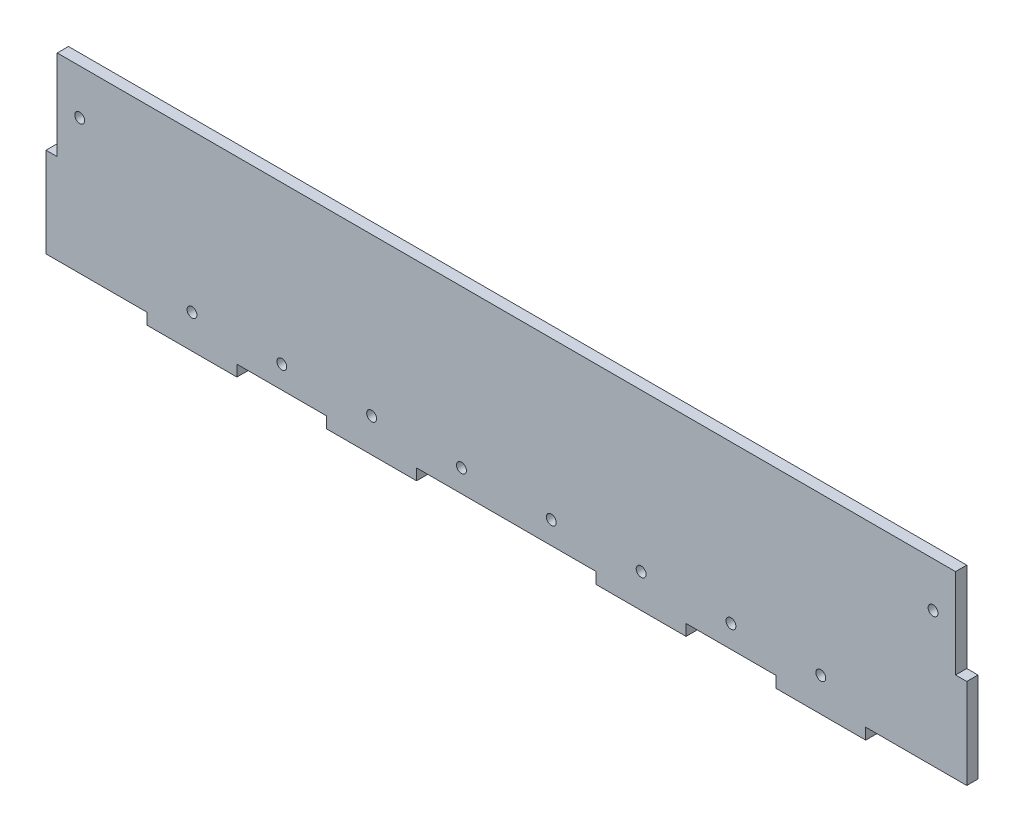
ISO-10303-21;
HEADER;
FILE_DESCRIPTION(('STEP AP214'),'2;1');
FILE_NAME('part.step','',(''),(''),'','','');
FILE_SCHEMA(('AUTOMOTIVE_DESIGN { 1 0 10303 214 1 1 1 1 }'));
ENDSEC;
DATA;
#1=APPLICATION_CONTEXT('core data for automotive mechanical design processes');
#2=APPLICATION_PROTOCOL_DEFINITION('international standard','automotive_design',2000,#1);
#3=PRODUCT_CONTEXT('',#1,'mechanical');
#4=PRODUCT('Part','Part','',(#3));
#5=PRODUCT_RELATED_PRODUCT_CATEGORY('part','',(#4));
#6=PRODUCT_DEFINITION_FORMATION('','',#4);
#7=PRODUCT_DEFINITION_CONTEXT('part definition',#1,'design');
#8=PRODUCT_DEFINITION('design','',#6,#7);
#9=PRODUCT_DEFINITION_SHAPE('','',#8);
#10=(LENGTH_UNIT() NAMED_UNIT(*) SI_UNIT(.MILLI.,.METRE.));
#11=(NAMED_UNIT(*) PLANE_ANGLE_UNIT() SI_UNIT($,.RADIAN.));
#12=(NAMED_UNIT(*) SI_UNIT($,.STERADIAN.) SOLID_ANGLE_UNIT());
#13=UNCERTAINTY_MEASURE_WITH_UNIT(LENGTH_MEASURE(1.E-05),#10,'distance_accuracy_value','');
#14=(GEOMETRIC_REPRESENTATION_CONTEXT(3) GLOBAL_UNCERTAINTY_ASSIGNED_CONTEXT((#13)) GLOBAL_UNIT_ASSIGNED_CONTEXT((#10,
#11,#12)) REPRESENTATION_CONTEXT('',''));
#15=CARTESIAN_POINT('',(0.,0.,0.));
#16=DIRECTION('',(0.,0.,1.));
#17=DIRECTION('',(1.,0.,0.));
#18=AXIS2_PLACEMENT_3D('',#15,#16,#17);
#19=CARTESIAN_POINT('',(-200.,0.,5.));
#20=DIRECTION('',(-1.,0.,0.));
#21=DIRECTION('',(0.,0.,1.));
#22=AXIS2_PLACEMENT_3D('',#19,#20,#21);
#23=PLANE('',#22);
#24=DIRECTION('',(0.,0.,1.));
#25=VECTOR('',#24,1.);
#26=CARTESIAN_POINT('',(-200.,-110.,0.));
#27=LINE('',#26,#25);
#28=CARTESIAN_POINT('',(-200.,-110.,0.));
#29=VERTEX_POINT('',#28);
#30=CARTESIAN_POINT('',(-200.,-110.,5.));
#31=VERTEX_POINT('',#30);
#32=EDGE_CURVE('E226',#29,#31,#27,.T.);
#33=ORIENTED_EDGE('',*,*,#32,.T.);
#34=DIRECTION('',(0.,1.,0.));
#35=VECTOR('',#34,1.);
#36=CARTESIAN_POINT('',(-200.,0.,5.));
#37=LINE('',#36,#35);
#38=CARTESIAN_POINT('',(-200.,-70.,5.));
#39=VERTEX_POINT('',#38);
#40=EDGE_CURVE('E220',#31,#39,#37,.T.);
#41=ORIENTED_EDGE('',*,*,#40,.T.);
#42=DIRECTION('',(0.,0.,1.));
#43=VECTOR('',#42,1.);
#44=CARTESIAN_POINT('',(-200.,-70.,0.));
#45=LINE('',#44,#43);
#46=CARTESIAN_POINT('',(-200.,-70.,0.));
#47=VERTEX_POINT('',#46);
#48=EDGE_CURVE('E202',#47,#39,#45,.T.);
#49=ORIENTED_EDGE('',*,*,#48,.F.);
#50=DIRECTION('',(0.,1.,0.));
#51=VECTOR('',#50,1.);
#52=CARTESIAN_POINT('',(-200.,0.,0.));
#53=LINE('',#52,#51);
#54=EDGE_CURVE('E343',#29,#47,#53,.T.);
#55=ORIENTED_EDGE('',*,*,#54,.F.);
#56=EDGE_LOOP('',(#33,#41,#49,#55));
#57=FACE_BOUND('',#56,.T.);
#58=ADVANCED_FACE('F40',(#57),#23,.T.);
#59=CARTESIAN_POINT('',(200.,0.,5.));
#60=DIRECTION('',(-1.,0.,0.));
#61=DIRECTION('',(0.,0.,1.));
#62=AXIS2_PLACEMENT_3D('',#59,#60,#61);
#63=PLANE('',#62);
#64=DIRECTION('',(0.,1.,0.));
#65=VECTOR('',#64,1.);
#66=CARTESIAN_POINT('',(200.,0.,0.));
#67=LINE('',#66,#65);
#68=CARTESIAN_POINT('',(200.,-109.868690954633,0.));
#69=VERTEX_POINT('',#68);
#70=CARTESIAN_POINT('',(200.,-70.,0.));
#71=VERTEX_POINT('',#70);
#72=EDGE_CURVE('E339',#69,#71,#67,.T.);
#73=ORIENTED_EDGE('',*,*,#72,.T.);
#74=DIRECTION('',(0.,0.,1.));
#75=VECTOR('',#74,1.);
#76=CARTESIAN_POINT('',(200.,-70.,0.));
#77=LINE('',#76,#75);
#78=CARTESIAN_POINT('',(200.,-70.,5.));
#79=VERTEX_POINT('',#78);
#80=EDGE_CURVE('E56',#71,#79,#77,.T.);
#81=ORIENTED_EDGE('',*,*,#80,.T.);
#82=DIRECTION('',(0.,1.,0.));
#83=VECTOR('',#82,1.);
#84=CARTESIAN_POINT('',(200.,0.,5.));
#85=LINE('',#84,#83);
#86=CARTESIAN_POINT('',(200.,-109.868690954633,5.));
#87=VERTEX_POINT('',#86);
#88=EDGE_CURVE('E222',#87,#79,#85,.T.);
#89=ORIENTED_EDGE('',*,*,#88,.F.);
#90=DIRECTION('',(0.,0.,1.));
#91=VECTOR('',#90,1.);
#92=CARTESIAN_POINT('',(200.,-109.868690954633,-5.));
#93=LINE('',#92,#91);
#94=EDGE_CURVE('E509',#69,#87,#93,.T.);
#95=ORIENTED_EDGE('',*,*,#94,.F.);
#96=EDGE_LOOP('',(#73,#81,#89,#95));
#97=FACE_BOUND('',#96,.T.);
#98=ADVANCED_FACE('F563',(#97),#63,.F.);
#99=CARTESIAN_POINT('',(0.,-150.,5.));
#100=DIRECTION('',(0.,1.,0.));
#101=DIRECTION('',(0.,0.,1.));
#102=AXIS2_PLACEMENT_3D('',#99,#100,#101);
#103=PLANE('',#102);
#104=DIRECTION('',(1.,0.,0.));
#105=VECTOR('',#104,1.);
#106=CARTESIAN_POINT('',(0.,-150.,0.));
#107=LINE('',#106,#105);
#108=CARTESIAN_POINT('',(-205.,-150.,0.));
#109=VERTEX_POINT('',#108);
#110=CARTESIAN_POINT('',(-160.,-150.,0.));
#111=VERTEX_POINT('',#110);
#112=EDGE_CURVE('E346',#109,#111,#107,.T.);
#113=ORIENTED_EDGE('',*,*,#112,.T.);
#114=DIRECTION('',(0.,0.,-1.));
#115=VECTOR('',#114,1.);
#116=CARTESIAN_POINT('',(-160.,-150.,5.));
#117=LINE('',#116,#115);
#118=CARTESIAN_POINT('',(-160.,-150.,5.));
#119=VERTEX_POINT('',#118);
#120=EDGE_CURVE('E49',#119,#111,#117,.T.);
#121=ORIENTED_EDGE('',*,*,#120,.F.);
#122=DIRECTION('',(1.,0.,0.));
#123=VECTOR('',#122,1.);
#124=CARTESIAN_POINT('',(0.,-150.,5.));
#125=LINE('',#124,#123);
#126=CARTESIAN_POINT('',(-205.,-150.,5.));
#127=VERTEX_POINT('',#126);
#128=EDGE_CURVE('E228',#127,#119,#125,.T.);
#129=ORIENTED_EDGE('',*,*,#128,.F.);
#130=DIRECTION('',(0.,0.,1.));
#131=VECTOR('',#130,1.);
#132=CARTESIAN_POINT('',(-205.,-150.,0.));
#133=LINE('',#132,#131);
#134=EDGE_CURVE('E212',#109,#127,#133,.T.);
#135=ORIENTED_EDGE('',*,*,#134,.F.);
#136=EDGE_LOOP('',(#113,#121,#129,#135));
#137=FACE_BOUND('',#136,.T.);
#138=ADVANCED_FACE('F484',(#137),#103,.F.);
#139=CARTESIAN_POINT('',(-160.,0.,5.));
#140=DIRECTION('',(1.,0.,0.));
#141=DIRECTION('',(0.,0.,-1.));
#142=AXIS2_PLACEMENT_3D('',#139,#140,#141);
#143=PLANE('',#142);
#144=DIRECTION('',(0.,-1.,0.));
#145=VECTOR('',#144,1.);
#146=CARTESIAN_POINT('',(-160.,0.,0.));
#147=LINE('',#146,#145);
#148=CARTESIAN_POINT('',(-160.,-155.,0.));
#149=VERTEX_POINT('',#148);
#150=EDGE_CURVE('E350',#111,#149,#147,.T.);
#151=ORIENTED_EDGE('',*,*,#150,.T.);
#152=DIRECTION('',(0.,0.,-1.));
#153=VECTOR('',#152,1.);
#154=CARTESIAN_POINT('',(-160.,-155.,5.));
#155=LINE('',#154,#153);
#156=CARTESIAN_POINT('',(-160.,-155.,5.));
#157=VERTEX_POINT('',#156);
#158=EDGE_CURVE('E473',#157,#149,#155,.T.);
#159=ORIENTED_EDGE('',*,*,#158,.F.);
#160=DIRECTION('',(0.,-1.,0.));
#161=VECTOR('',#160,1.);
#162=CARTESIAN_POINT('',(-160.,0.,5.));
#163=LINE('',#162,#161);
#164=EDGE_CURVE('E233',#119,#157,#163,.T.);
#165=ORIENTED_EDGE('',*,*,#164,.F.);
#166=ORIENTED_EDGE('',*,*,#120,.T.);
#167=EDGE_LOOP('',(#151,#159,#165,#166));
#168=FACE_BOUND('',#167,.T.);
#169=ADVANCED_FACE('F480',(#168),#143,.F.);
#170=CARTESIAN_POINT('',(0.,-155.,5.));
#171=DIRECTION('',(0.,1.,0.));
#172=DIRECTION('',(0.,0.,1.));
#173=AXIS2_PLACEMENT_3D('',#170,#171,#172);
#174=PLANE('',#173);
#175=DIRECTION('',(1.,0.,0.));
#176=VECTOR('',#175,1.);
#177=CARTESIAN_POINT('',(0.,-155.,0.));
#178=LINE('',#177,#176);
#179=CARTESIAN_POINT('',(-120.,-155.,0.));
#180=VERTEX_POINT('',#179);
#181=EDGE_CURVE('E354',#149,#180,#178,.T.);
#182=ORIENTED_EDGE('',*,*,#181,.T.);
#183=DIRECTION('',(0.,0.,-1.));
#184=VECTOR('',#183,1.);
#185=CARTESIAN_POINT('',(-120.,-155.,5.));
#186=LINE('',#185,#184);
#187=CARTESIAN_POINT('',(-120.,-155.,5.));
#188=VERTEX_POINT('',#187);
#189=EDGE_CURVE('E469',#188,#180,#186,.T.);
#190=ORIENTED_EDGE('',*,*,#189,.F.);
#191=DIRECTION('',(1.,0.,0.));
#192=VECTOR('',#191,1.);
#193=CARTESIAN_POINT('',(0.,-155.,5.));
#194=LINE('',#193,#192);
#195=EDGE_CURVE('E242',#157,#188,#194,.T.);
#196=ORIENTED_EDGE('',*,*,#195,.F.);
#197=ORIENTED_EDGE('',*,*,#158,.T.);
#198=EDGE_LOOP('',(#182,#190,#196,#197));
#199=FACE_BOUND('',#198,.T.);
#200=ADVANCED_FACE('F491',(#199),#174,.F.);
#201=CARTESIAN_POINT('',(-120.,0.,5.));
#202=DIRECTION('',(-1.,0.,0.));
#203=DIRECTION('',(0.,0.,1.));
#204=AXIS2_PLACEMENT_3D('',#201,#202,#203);
#205=PLANE('',#204);
#206=DIRECTION('',(0.,1.,0.));
#207=VECTOR('',#206,1.);
#208=CARTESIAN_POINT('',(-120.,0.,0.));
#209=LINE('',#208,#207);
#210=CARTESIAN_POINT('',(-120.,-150.,0.));
#211=VERTEX_POINT('',#210);
#212=EDGE_CURVE('E358',#180,#211,#209,.T.);
#213=ORIENTED_EDGE('',*,*,#212,.T.);
#214=DIRECTION('',(0.,0.,-1.));
#215=VECTOR('',#214,1.);
#216=CARTESIAN_POINT('',(-120.,-150.,5.));
#217=LINE('',#216,#215);
#218=CARTESIAN_POINT('',(-120.,-150.,5.));
#219=VERTEX_POINT('',#218);
#220=EDGE_CURVE('E465',#219,#211,#217,.T.);
#221=ORIENTED_EDGE('',*,*,#220,.F.);
#222=DIRECTION('',(0.,1.,0.));
#223=VECTOR('',#222,1.);
#224=CARTESIAN_POINT('',(-120.,0.,5.));
#225=LINE('',#224,#223);
#226=EDGE_CURVE('E246',#188,#219,#225,.T.);
#227=ORIENTED_EDGE('',*,*,#226,.F.);
#228=ORIENTED_EDGE('',*,*,#189,.T.);
#229=EDGE_LOOP('',(#213,#221,#227,#228));
#230=FACE_BOUND('',#229,.T.);
#231=ADVANCED_FACE('F805',(#230),#205,.F.);
#232=CARTESIAN_POINT('',(0.,-150.,5.));
#233=DIRECTION('',(0.,1.,0.));
#234=DIRECTION('',(0.,0.,1.));
#235=AXIS2_PLACEMENT_3D('',#232,#233,#234);
#236=PLANE('',#235);
#237=DIRECTION('',(1.,0.,0.));
#238=VECTOR('',#237,1.);
#239=CARTESIAN_POINT('',(0.,-150.,0.));
#240=LINE('',#239,#238);
#241=CARTESIAN_POINT('',(-80.,-150.,0.));
#242=VERTEX_POINT('',#241);
#243=EDGE_CURVE('E362',#211,#242,#240,.T.);
#244=ORIENTED_EDGE('',*,*,#243,.T.);
#245=DIRECTION('',(0.,0.,-1.));
#246=VECTOR('',#245,1.);
#247=CARTESIAN_POINT('',(-80.,-150.,5.));
#248=LINE('',#247,#246);
#249=CARTESIAN_POINT('',(-80.,-150.,5.));
#250=VERTEX_POINT('',#249);
#251=EDGE_CURVE('E461',#250,#242,#248,.T.);
#252=ORIENTED_EDGE('',*,*,#251,.F.);
#253=DIRECTION('',(1.,0.,0.));
#254=VECTOR('',#253,1.);
#255=CARTESIAN_POINT('',(0.,-150.,5.));
#256=LINE('',#255,#254);
#257=EDGE_CURVE('E250',#219,#250,#256,.T.);
#258=ORIENTED_EDGE('',*,*,#257,.F.);
#259=ORIENTED_EDGE('',*,*,#220,.T.);
#260=EDGE_LOOP('',(#244,#252,#258,#259));
#261=FACE_BOUND('',#260,.T.);
#262=ADVANCED_FACE('F802',(#261),#236,.F.);
#263=CARTESIAN_POINT('',(-80.,0.,5.));
#264=DIRECTION('',(1.,0.,0.));
#265=DIRECTION('',(0.,0.,-1.));
#266=AXIS2_PLACEMENT_3D('',#263,#264,#265);
#267=PLANE('',#266);
#268=DIRECTION('',(0.,-1.,0.));
#269=VECTOR('',#268,1.);
#270=CARTESIAN_POINT('',(-80.,0.,0.));
#271=LINE('',#270,#269);
#272=CARTESIAN_POINT('',(-80.,-155.,0.));
#273=VERTEX_POINT('',#272);
#274=EDGE_CURVE('E366',#242,#273,#271,.T.);
#275=ORIENTED_EDGE('',*,*,#274,.T.);
#276=DIRECTION('',(0.,0.,-1.));
#277=VECTOR('',#276,1.);
#278=CARTESIAN_POINT('',(-80.,-155.,5.));
#279=LINE('',#278,#277);
#280=CARTESIAN_POINT('',(-80.,-155.,5.));
#281=VERTEX_POINT('',#280);
#282=EDGE_CURVE('E457',#281,#273,#279,.T.);
#283=ORIENTED_EDGE('',*,*,#282,.F.);
#284=DIRECTION('',(0.,-1.,0.));
#285=VECTOR('',#284,1.);
#286=CARTESIAN_POINT('',(-80.,0.,5.));
#287=LINE('',#286,#285);
#288=EDGE_CURVE('E254',#250,#281,#287,.T.);
#289=ORIENTED_EDGE('',*,*,#288,.F.);
#290=ORIENTED_EDGE('',*,*,#251,.T.);
#291=EDGE_LOOP('',(#275,#283,#289,#290));
#292=FACE_BOUND('',#291,.T.);
#293=ADVANCED_FACE('F799',(#292),#267,.F.);
#294=CARTESIAN_POINT('',(0.,-155.,5.));
#295=DIRECTION('',(0.,1.,0.));
#296=DIRECTION('',(0.,0.,1.));
#297=AXIS2_PLACEMENT_3D('',#294,#295,#296);
#298=PLANE('',#297);
#299=DIRECTION('',(1.,0.,0.));
#300=VECTOR('',#299,1.);
#301=CARTESIAN_POINT('',(0.,-155.,0.));
#302=LINE('',#301,#300);
#303=CARTESIAN_POINT('',(-40.,-155.,0.));
#304=VERTEX_POINT('',#303);
#305=EDGE_CURVE('E370',#273,#304,#302,.T.);
#306=ORIENTED_EDGE('',*,*,#305,.T.);
#307=DIRECTION('',(0.,0.,-1.));
#308=VECTOR('',#307,1.);
#309=CARTESIAN_POINT('',(-40.,-155.,5.));
#310=LINE('',#309,#308);
#311=CARTESIAN_POINT('',(-40.,-155.,5.));
#312=VERTEX_POINT('',#311);
#313=EDGE_CURVE('E453',#312,#304,#310,.T.);
#314=ORIENTED_EDGE('',*,*,#313,.F.);
#315=DIRECTION('',(1.,0.,0.));
#316=VECTOR('',#315,1.);
#317=CARTESIAN_POINT('',(0.,-155.,5.));
#318=LINE('',#317,#316);
#319=EDGE_CURVE('E258',#281,#312,#318,.T.);
#320=ORIENTED_EDGE('',*,*,#319,.F.);
#321=ORIENTED_EDGE('',*,*,#282,.T.);
#322=EDGE_LOOP('',(#306,#314,#320,#321));
#323=FACE_BOUND('',#322,.T.);
#324=ADVANCED_FACE('F797',(#323),#298,.F.);
#325=CARTESIAN_POINT('',(-39.9999999999998,0.,5.));
#326=DIRECTION('',(-1.,0.,0.));
#327=DIRECTION('',(0.,-1.,0.));
#328=AXIS2_PLACEMENT_3D('',#325,#326,#327);
#329=PLANE('',#328);
#330=DIRECTION('',(0.,1.,0.));
#331=VECTOR('',#330,1.);
#332=CARTESIAN_POINT('',(-39.9999999999998,0.,0.));
#333=LINE('',#332,#331);
#334=CARTESIAN_POINT('',(-40.,-150.,0.));
#335=VERTEX_POINT('',#334);
#336=EDGE_CURVE('E374',#304,#335,#333,.T.);
#337=ORIENTED_EDGE('',*,*,#336,.T.);
#338=DIRECTION('',(0.,0.,-1.));
#339=VECTOR('',#338,1.);
#340=CARTESIAN_POINT('',(-40.,-150.,5.));
#341=LINE('',#340,#339);
#342=CARTESIAN_POINT('',(-40.,-150.,5.));
#343=VERTEX_POINT('',#342);
#344=EDGE_CURVE('E449',#343,#335,#341,.T.);
#345=ORIENTED_EDGE('',*,*,#344,.F.);
#346=DIRECTION('',(0.,1.,0.));
#347=VECTOR('',#346,1.);
#348=CARTESIAN_POINT('',(-39.9999999999998,0.,5.));
#349=LINE('',#348,#347);
#350=EDGE_CURVE('E262',#312,#343,#349,.T.);
#351=ORIENTED_EDGE('',*,*,#350,.F.);
#352=ORIENTED_EDGE('',*,*,#313,.T.);
#353=EDGE_LOOP('',(#337,#345,#351,#352));
#354=FACE_BOUND('',#353,.T.);
#355=ADVANCED_FACE('F793',(#354),#329,.F.);
#356=CARTESIAN_POINT('',(0.,-150.,5.));
#357=DIRECTION('',(0.,1.,0.));
#358=DIRECTION('',(0.,0.,1.));
#359=AXIS2_PLACEMENT_3D('',#356,#357,#358);
#360=PLANE('',#359);
#361=DIRECTION('',(1.,0.,0.));
#362=VECTOR('',#361,1.);
#363=CARTESIAN_POINT('',(0.,-150.,0.));
#364=LINE('',#363,#362);
#365=CARTESIAN_POINT('',(40.,-150.,0.));
#366=VERTEX_POINT('',#365);
#367=EDGE_CURVE('E378',#335,#366,#364,.T.);
#368=ORIENTED_EDGE('',*,*,#367,.T.);
#369=DIRECTION('',(0.,0.,-1.));
#370=VECTOR('',#369,1.);
#371=CARTESIAN_POINT('',(40.,-150.,5.));
#372=LINE('',#371,#370);
#373=CARTESIAN_POINT('',(40.,-150.,5.));
#374=VERTEX_POINT('',#373);
#375=EDGE_CURVE('E445',#374,#366,#372,.T.);
#376=ORIENTED_EDGE('',*,*,#375,.F.);
#377=DIRECTION('',(1.,0.,0.));
#378=VECTOR('',#377,1.);
#379=CARTESIAN_POINT('',(0.,-150.,5.));
#380=LINE('',#379,#378);
#381=EDGE_CURVE('E266',#343,#374,#380,.T.);
#382=ORIENTED_EDGE('',*,*,#381,.F.);
#383=ORIENTED_EDGE('',*,*,#344,.T.);
#384=EDGE_LOOP('',(#368,#376,#382,#383));
#385=FACE_BOUND('',#384,.T.);
#386=ADVANCED_FACE('F790',(#385),#360,.F.);
#387=CARTESIAN_POINT('',(40.,0.,5.));
#388=DIRECTION('',(1.,0.,0.));
#389=DIRECTION('',(0.,0.,-1.));
#390=AXIS2_PLACEMENT_3D('',#387,#388,#389);
#391=PLANE('',#390);
#392=DIRECTION('',(0.,-1.,0.));
#393=VECTOR('',#392,1.);
#394=CARTESIAN_POINT('',(40.,0.,0.));
#395=LINE('',#394,#393);
#396=CARTESIAN_POINT('',(40.,-155.,0.));
#397=VERTEX_POINT('',#396);
#398=EDGE_CURVE('E382',#366,#397,#395,.T.);
#399=ORIENTED_EDGE('',*,*,#398,.T.);
#400=DIRECTION('',(0.,0.,-1.));
#401=VECTOR('',#400,1.);
#402=CARTESIAN_POINT('',(40.,-155.,5.));
#403=LINE('',#402,#401);
#404=CARTESIAN_POINT('',(40.,-155.,5.));
#405=VERTEX_POINT('',#404);
#406=EDGE_CURVE('E441',#405,#397,#403,.T.);
#407=ORIENTED_EDGE('',*,*,#406,.F.);
#408=DIRECTION('',(0.,-1.,0.));
#409=VECTOR('',#408,1.);
#410=CARTESIAN_POINT('',(40.,0.,5.));
#411=LINE('',#410,#409);
#412=EDGE_CURVE('E270',#374,#405,#411,.T.);
#413=ORIENTED_EDGE('',*,*,#412,.F.);
#414=ORIENTED_EDGE('',*,*,#375,.T.);
#415=EDGE_LOOP('',(#399,#407,#413,#414));
#416=FACE_BOUND('',#415,.T.);
#417=ADVANCED_FACE('F788',(#416),#391,.F.);
#418=CARTESIAN_POINT('',(0.,-155.,5.));
#419=DIRECTION('',(0.,1.,0.));
#420=DIRECTION('',(0.,0.,1.));
#421=AXIS2_PLACEMENT_3D('',#418,#419,#420);
#422=PLANE('',#421);
#423=DIRECTION('',(1.,0.,0.));
#424=VECTOR('',#423,1.);
#425=CARTESIAN_POINT('',(0.,-155.,0.));
#426=LINE('',#425,#424);
#427=CARTESIAN_POINT('',(80.,-155.,0.));
#428=VERTEX_POINT('',#427);
#429=EDGE_CURVE('E386',#397,#428,#426,.T.);
#430=ORIENTED_EDGE('',*,*,#429,.T.);
#431=DIRECTION('',(0.,0.,-1.));
#432=VECTOR('',#431,1.);
#433=CARTESIAN_POINT('',(80.,-155.,5.));
#434=LINE('',#433,#432);
#435=CARTESIAN_POINT('',(80.,-155.,5.));
#436=VERTEX_POINT('',#435);
#437=EDGE_CURVE('E437',#436,#428,#434,.T.);
#438=ORIENTED_EDGE('',*,*,#437,.F.);
#439=DIRECTION('',(1.,0.,0.));
#440=VECTOR('',#439,1.);
#441=CARTESIAN_POINT('',(0.,-155.,5.));
#442=LINE('',#441,#440);
#443=EDGE_CURVE('E274',#405,#436,#442,.T.);
#444=ORIENTED_EDGE('',*,*,#443,.F.);
#445=ORIENTED_EDGE('',*,*,#406,.T.);
#446=EDGE_LOOP('',(#430,#438,#444,#445));
#447=FACE_BOUND('',#446,.T.);
#448=ADVANCED_FACE('F784',(#447),#422,.F.);
#449=CARTESIAN_POINT('',(80.,0.,5.));
#450=DIRECTION('',(-1.,0.,0.));
#451=DIRECTION('',(0.,0.,1.));
#452=AXIS2_PLACEMENT_3D('',#449,#450,#451);
#453=PLANE('',#452);
#454=DIRECTION('',(0.,1.,0.));
#455=VECTOR('',#454,1.);
#456=CARTESIAN_POINT('',(80.,0.,0.));
#457=LINE('',#456,#455);
#458=CARTESIAN_POINT('',(80.,-150.,0.));
#459=VERTEX_POINT('',#458);
#460=EDGE_CURVE('E390',#428,#459,#457,.T.);
#461=ORIENTED_EDGE('',*,*,#460,.T.);
#462=DIRECTION('',(0.,0.,-1.));
#463=VECTOR('',#462,1.);
#464=CARTESIAN_POINT('',(80.,-150.,5.));
#465=LINE('',#464,#463);
#466=CARTESIAN_POINT('',(80.,-150.,5.));
#467=VERTEX_POINT('',#466);
#468=EDGE_CURVE('E433',#467,#459,#465,.T.);
#469=ORIENTED_EDGE('',*,*,#468,.F.);
#470=DIRECTION('',(0.,1.,0.));
#471=VECTOR('',#470,1.);
#472=CARTESIAN_POINT('',(80.,0.,5.));
#473=LINE('',#472,#471);
#474=EDGE_CURVE('E278',#436,#467,#473,.T.);
#475=ORIENTED_EDGE('',*,*,#474,.F.);
#476=ORIENTED_EDGE('',*,*,#437,.T.);
#477=EDGE_LOOP('',(#461,#469,#475,#476));
#478=FACE_BOUND('',#477,.T.);
#479=ADVANCED_FACE('F781',(#478),#453,.F.);
#480=CARTESIAN_POINT('',(0.,-150.,5.));
#481=DIRECTION('',(0.,1.,0.));
#482=DIRECTION('',(0.,0.,1.));
#483=AXIS2_PLACEMENT_3D('',#480,#481,#482);
#484=PLANE('',#483);
#485=DIRECTION('',(1.,0.,0.));
#486=VECTOR('',#485,1.);
#487=CARTESIAN_POINT('',(0.,-150.,0.));
#488=LINE('',#487,#486);
#489=CARTESIAN_POINT('',(120.,-150.,0.));
#490=VERTEX_POINT('',#489);
#491=EDGE_CURVE('E394',#459,#490,#488,.T.);
#492=ORIENTED_EDGE('',*,*,#491,.T.);
#493=DIRECTION('',(0.,0.,-1.));
#494=VECTOR('',#493,1.);
#495=CARTESIAN_POINT('',(120.,-150.,5.));
#496=LINE('',#495,#494);
#497=CARTESIAN_POINT('',(120.,-150.,5.));
#498=VERTEX_POINT('',#497);
#499=EDGE_CURVE('E429',#498,#490,#496,.T.);
#500=ORIENTED_EDGE('',*,*,#499,.F.);
#501=DIRECTION('',(1.,0.,0.));
#502=VECTOR('',#501,1.);
#503=CARTESIAN_POINT('',(0.,-150.,5.));
#504=LINE('',#503,#502);
#505=EDGE_CURVE('E282',#467,#498,#504,.T.);
#506=ORIENTED_EDGE('',*,*,#505,.F.);
#507=ORIENTED_EDGE('',*,*,#468,.T.);
#508=EDGE_LOOP('',(#492,#500,#506,#507));
#509=FACE_BOUND('',#508,.T.);
#510=ADVANCED_FACE('F779',(#509),#484,.F.);
#511=CARTESIAN_POINT('',(120.,0.,5.));
#512=DIRECTION('',(1.,0.,0.));
#513=DIRECTION('',(0.,0.,-1.));
#514=AXIS2_PLACEMENT_3D('',#511,#512,#513);
#515=PLANE('',#514);
#516=DIRECTION('',(0.,-1.,0.));
#517=VECTOR('',#516,1.);
#518=CARTESIAN_POINT('',(120.,0.,0.));
#519=LINE('',#518,#517);
#520=CARTESIAN_POINT('',(120.,-155.,0.));
#521=VERTEX_POINT('',#520);
#522=EDGE_CURVE('E398',#490,#521,#519,.T.);
#523=ORIENTED_EDGE('',*,*,#522,.T.);
#524=DIRECTION('',(0.,0.,-1.));
#525=VECTOR('',#524,1.);
#526=CARTESIAN_POINT('',(120.,-155.,5.));
#527=LINE('',#526,#525);
#528=CARTESIAN_POINT('',(120.,-155.,5.));
#529=VERTEX_POINT('',#528);
#530=EDGE_CURVE('E425',#529,#521,#527,.T.);
#531=ORIENTED_EDGE('',*,*,#530,.F.);
#532=DIRECTION('',(0.,-1.,0.));
#533=VECTOR('',#532,1.);
#534=CARTESIAN_POINT('',(120.,0.,5.));
#535=LINE('',#534,#533);
#536=EDGE_CURVE('E286',#498,#529,#535,.T.);
#537=ORIENTED_EDGE('',*,*,#536,.F.);
#538=ORIENTED_EDGE('',*,*,#499,.T.);
#539=EDGE_LOOP('',(#523,#531,#537,#538));
#540=FACE_BOUND('',#539,.T.);
#541=ADVANCED_FACE('F775',(#540),#515,.F.);
#542=CARTESIAN_POINT('',(0.,-155.,5.));
#543=DIRECTION('',(0.,1.,0.));
#544=DIRECTION('',(0.,0.,1.));
#545=AXIS2_PLACEMENT_3D('',#542,#543,#544);
#546=PLANE('',#545);
#547=DIRECTION('',(1.,0.,0.));
#548=VECTOR('',#547,1.);
#549=CARTESIAN_POINT('',(0.,-155.,0.));
#550=LINE('',#549,#548);
#551=CARTESIAN_POINT('',(160.,-155.,0.));
#552=VERTEX_POINT('',#551);
#553=EDGE_CURVE('E402',#521,#552,#550,.T.);
#554=ORIENTED_EDGE('',*,*,#553,.T.);
#555=DIRECTION('',(0.,0.,-1.));
#556=VECTOR('',#555,1.);
#557=CARTESIAN_POINT('',(160.,-155.,5.));
#558=LINE('',#557,#556);
#559=CARTESIAN_POINT('',(160.,-155.,5.));
#560=VERTEX_POINT('',#559);
#561=EDGE_CURVE('E421',#560,#552,#558,.T.);
#562=ORIENTED_EDGE('',*,*,#561,.F.);
#563=DIRECTION('',(1.,0.,0.));
#564=VECTOR('',#563,1.);
#565=CARTESIAN_POINT('',(0.,-155.,5.));
#566=LINE('',#565,#564);
#567=EDGE_CURVE('E290',#529,#560,#566,.T.);
#568=ORIENTED_EDGE('',*,*,#567,.F.);
#569=ORIENTED_EDGE('',*,*,#530,.T.);
#570=EDGE_LOOP('',(#554,#562,#568,#569));
#571=FACE_BOUND('',#570,.T.);
#572=ADVANCED_FACE('F772',(#571),#546,.F.);
#573=CARTESIAN_POINT('',(160.,0.,5.));
#574=DIRECTION('',(-1.,0.,0.));
#575=DIRECTION('',(0.,0.,1.));
#576=AXIS2_PLACEMENT_3D('',#573,#574,#575);
#577=PLANE('',#576);
#578=DIRECTION('',(0.,1.,0.));
#579=VECTOR('',#578,1.);
#580=CARTESIAN_POINT('',(160.,0.,0.));
#581=LINE('',#580,#579);
#582=CARTESIAN_POINT('',(160.,-150.,0.));
#583=VERTEX_POINT('',#582);
#584=EDGE_CURVE('E406',#552,#583,#581,.T.);
#585=ORIENTED_EDGE('',*,*,#584,.T.);
#586=DIRECTION('',(0.,0.,-1.));
#587=VECTOR('',#586,1.);
#588=CARTESIAN_POINT('',(160.,-150.,5.));
#589=LINE('',#588,#587);
#590=CARTESIAN_POINT('',(160.,-150.,5.));
#591=VERTEX_POINT('',#590);
#592=EDGE_CURVE('E305',#591,#583,#589,.T.);
#593=ORIENTED_EDGE('',*,*,#592,.F.);
#594=DIRECTION('',(0.,1.,0.));
#595=VECTOR('',#594,1.);
#596=CARTESIAN_POINT('',(160.,0.,5.));
#597=LINE('',#596,#595);
#598=EDGE_CURVE('E294',#560,#591,#597,.T.);
#599=ORIENTED_EDGE('',*,*,#598,.F.);
#600=ORIENTED_EDGE('',*,*,#561,.T.);
#601=EDGE_LOOP('',(#585,#593,#599,#600));
#602=FACE_BOUND('',#601,.T.);
#603=ADVANCED_FACE('F663',(#602),#577,.F.);
#604=CARTESIAN_POINT('',(0.,-150.,5.));
#605=DIRECTION('',(0.,1.,0.));
#606=DIRECTION('',(0.,0.,1.));
#607=AXIS2_PLACEMENT_3D('',#604,#605,#606);
#608=PLANE('',#607);
#609=DIRECTION('',(1.,0.,0.));
#610=VECTOR('',#609,1.);
#611=CARTESIAN_POINT('',(0.,-150.,0.));
#612=LINE('',#611,#610);
#613=CARTESIAN_POINT('',(205.,-150.,0.));
#614=VERTEX_POINT('',#613);
#615=EDGE_CURVE('E410',#583,#614,#612,.T.);
#616=ORIENTED_EDGE('',*,*,#615,.T.);
#617=DIRECTION('',(0.,0.,1.));
#618=VECTOR('',#617,1.);
#619=CARTESIAN_POINT('',(205.,-150.,0.));
#620=LINE('',#619,#618);
#621=CARTESIAN_POINT('',(205.,-150.,5.));
#622=VERTEX_POINT('',#621);
#623=EDGE_CURVE('E751',#614,#622,#620,.T.);
#624=ORIENTED_EDGE('',*,*,#623,.T.);
#625=DIRECTION('',(1.,0.,0.));
#626=VECTOR('',#625,1.);
#627=CARTESIAN_POINT('',(0.,-150.,5.));
#628=LINE('',#627,#626);
#629=EDGE_CURVE('E298',#591,#622,#628,.T.);
#630=ORIENTED_EDGE('',*,*,#629,.F.);
#631=ORIENTED_EDGE('',*,*,#592,.T.);
#632=EDGE_LOOP('',(#616,#624,#630,#631));
#633=FACE_BOUND('',#632,.T.);
#634=ADVANCED_FACE('F660',(#633),#608,.F.);
#635=CARTESIAN_POINT('',(205.,0.,5.));
#636=DIRECTION('',(1.,0.,0.));
#637=DIRECTION('',(0.,0.,-1.));
#638=AXIS2_PLACEMENT_3D('',#635,#636,#637);
#639=PLANE('',#638);
#640=DIRECTION('',(0.,0.,1.));
#641=VECTOR('',#640,1.);
#642=CARTESIAN_POINT('',(205.,-109.868690954633,-5.));
#643=LINE('',#642,#641);
#644=CARTESIAN_POINT('',(205.,-109.868690954633,0.));
#645=VERTEX_POINT('',#644);
#646=CARTESIAN_POINT('',(205.,-109.868690954633,5.));
#647=VERTEX_POINT('',#646);
#648=EDGE_CURVE('E311',#645,#647,#643,.T.);
#649=ORIENTED_EDGE('',*,*,#648,.T.);
#650=DIRECTION('',(0.,-1.,0.));
#651=VECTOR('',#650,1.);
#652=CARTESIAN_POINT('',(205.,0.,5.));
#653=LINE('',#652,#651);
#654=EDGE_CURVE('E301',#647,#622,#653,.T.);
#655=ORIENTED_EDGE('',*,*,#654,.T.);
#656=ORIENTED_EDGE('',*,*,#623,.F.);
#657=DIRECTION('',(0.,-1.,0.));
#658=VECTOR('',#657,1.);
#659=CARTESIAN_POINT('',(205.,0.,0.));
#660=LINE('',#659,#658);
#661=EDGE_CURVE('E413',#645,#614,#660,.T.);
#662=ORIENTED_EDGE('',*,*,#661,.F.);
#663=EDGE_LOOP('',(#649,#655,#656,#662));
#664=FACE_BOUND('',#663,.T.);
#665=ADVANCED_FACE('F576',(#664),#639,.T.);
#666=CARTESIAN_POINT('',(-140.,-140.,5.));
#667=DIRECTION('',(0.,0.,-1.));
#668=DIRECTION('',(-1.,0.,0.));
#669=AXIS2_PLACEMENT_3D('',#666,#667,#668);
#670=CYLINDRICAL_SURFACE('',#669,2.20000000000001);
#671=CARTESIAN_POINT('',(-140.,-140.,5.));
#672=DIRECTION('',(0.,0.,1.));
#673=DIRECTION('',(1.,0.,0.));
#674=AXIS2_PLACEMENT_3D('',#671,#672,#673);
#675=CIRCLE('',#674,2.20000000000001);
#676=CARTESIAN_POINT('',(-137.8,-140.,5.));
#677=VERTEX_POINT('',#676);
#678=EDGE_CURVE('E235',#677,#677,#675,.T.);
#679=ORIENTED_EDGE('',*,*,#678,.T.);
#680=EDGE_LOOP('',(#679));
#681=FACE_BOUND('',#680,.T.);
#682=CARTESIAN_POINT('',(-140.,-140.,0.));
#683=DIRECTION('',(0.,0.,1.));
#684=DIRECTION('',(1.,0.,0.));
#685=AXIS2_PLACEMENT_3D('',#682,#683,#684);
#686=CIRCLE('',#685,2.20000000000001);
#687=CARTESIAN_POINT('',(-137.8,-140.,0.));
#688=VERTEX_POINT('',#687);
#689=EDGE_CURVE('E335',#688,#688,#686,.T.);
#690=ORIENTED_EDGE('',*,*,#689,.F.);
#691=EDGE_LOOP('',(#690));
#692=FACE_BOUND('',#691,.T.);
#693=ADVANCED_FACE('F546',(#681,#692),#670,.F.);
#694=CARTESIAN_POINT('',(-100.,-140.,5.));
#695=DIRECTION('',(0.,0.,-1.));
#696=DIRECTION('',(-1.,0.,0.));
#697=AXIS2_PLACEMENT_3D('',#694,#695,#696);
#698=CYLINDRICAL_SURFACE('',#697,2.20000000000001);
#699=CARTESIAN_POINT('',(-100.,-140.,5.));
#700=DIRECTION('',(0.,0.,1.));
#701=DIRECTION('',(1.,0.,0.));
#702=AXIS2_PLACEMENT_3D('',#699,#700,#701);
#703=CIRCLE('',#702,2.20000000000001);
#704=CARTESIAN_POINT('',(-97.8,-140.,5.));
#705=VERTEX_POINT('',#704);
#706=EDGE_CURVE('E539',#705,#705,#703,.T.);
#707=ORIENTED_EDGE('',*,*,#706,.T.);
#708=EDGE_LOOP('',(#707));
#709=FACE_BOUND('',#708,.T.);
#710=CARTESIAN_POINT('',(-100.,-140.,0.));
#711=DIRECTION('',(0.,0.,1.));
#712=DIRECTION('',(1.,0.,0.));
#713=AXIS2_PLACEMENT_3D('',#710,#711,#712);
#714=CIRCLE('',#713,2.20000000000001);
#715=CARTESIAN_POINT('',(-97.8,-140.,0.));
#716=VERTEX_POINT('',#715);
#717=EDGE_CURVE('E331',#716,#716,#714,.T.);
#718=ORIENTED_EDGE('',*,*,#717,.F.);
#719=EDGE_LOOP('',(#718));
#720=FACE_BOUND('',#719,.T.);
#721=ADVANCED_FACE('F575',(#709,#720),#698,.F.);
#722=CARTESIAN_POINT('',(-60.,-140.,5.));
#723=DIRECTION('',(0.,0.,-1.));
#724=DIRECTION('',(-1.,0.,0.));
#725=AXIS2_PLACEMENT_3D('',#722,#723,#724);
#726=CYLINDRICAL_SURFACE('',#725,2.20000000000001);
#727=CARTESIAN_POINT('',(-60.,-140.,5.));
#728=DIRECTION('',(0.,0.,1.));
#729=DIRECTION('',(1.,0.,0.));
#730=AXIS2_PLACEMENT_3D('',#727,#728,#729);
#731=CIRCLE('',#730,2.20000000000001);
#732=CARTESIAN_POINT('',(-57.8,-140.,5.));
#733=VERTEX_POINT('',#732);
#734=EDGE_CURVE('E535',#733,#733,#731,.T.);
#735=ORIENTED_EDGE('',*,*,#734,.T.);
#736=EDGE_LOOP('',(#735));
#737=FACE_BOUND('',#736,.T.);
#738=CARTESIAN_POINT('',(-60.,-140.,0.));
#739=DIRECTION('',(0.,0.,1.));
#740=DIRECTION('',(1.,0.,0.));
#741=AXIS2_PLACEMENT_3D('',#738,#739,#740);
#742=CIRCLE('',#741,2.20000000000001);
#743=CARTESIAN_POINT('',(-57.8,-140.,0.));
#744=VERTEX_POINT('',#743);
#745=EDGE_CURVE('E327',#744,#744,#742,.T.);
#746=ORIENTED_EDGE('',*,*,#745,.F.);
#747=EDGE_LOOP('',(#746));
#748=FACE_BOUND('',#747,.T.);
#749=ADVANCED_FACE('F579',(#737,#748),#726,.F.);
#750=CARTESIAN_POINT('',(-20.,-140.,5.));
#751=DIRECTION('',(0.,0.,-1.));
#752=DIRECTION('',(-1.,0.,0.));
#753=AXIS2_PLACEMENT_3D('',#750,#751,#752);
#754=CYLINDRICAL_SURFACE('',#753,2.20000000000001);
#755=CARTESIAN_POINT('',(-20.,-140.,5.));
#756=DIRECTION('',(0.,0.,1.));
#757=DIRECTION('',(1.,0.,0.));
#758=AXIS2_PLACEMENT_3D('',#755,#756,#757);
#759=CIRCLE('',#758,2.20000000000001);
#760=CARTESIAN_POINT('',(-17.8,-140.,5.));
#761=VERTEX_POINT('',#760);
#762=EDGE_CURVE('E531',#761,#761,#759,.T.);
#763=ORIENTED_EDGE('',*,*,#762,.T.);
#764=EDGE_LOOP('',(#763));
#765=FACE_BOUND('',#764,.T.);
#766=CARTESIAN_POINT('',(-20.,-140.,0.));
#767=DIRECTION('',(0.,0.,1.));
#768=DIRECTION('',(1.,0.,0.));
#769=AXIS2_PLACEMENT_3D('',#766,#767,#768);
#770=CIRCLE('',#769,2.20000000000001);
#771=CARTESIAN_POINT('',(-17.8,-140.,0.));
#772=VERTEX_POINT('',#771);
#773=EDGE_CURVE('E323',#772,#772,#770,.T.);
#774=ORIENTED_EDGE('',*,*,#773,.F.);
#775=EDGE_LOOP('',(#774));
#776=FACE_BOUND('',#775,.T.);
#777=ADVANCED_FACE('F583',(#765,#776),#754,.F.);
#778=CARTESIAN_POINT('',(20.,-140.,5.));
#779=DIRECTION('',(0.,0.,-1.));
#780=DIRECTION('',(-1.,0.,0.));
#781=AXIS2_PLACEMENT_3D('',#778,#779,#780);
#782=CYLINDRICAL_SURFACE('',#781,2.20000000000001);
#783=CARTESIAN_POINT('',(20.,-140.,5.));
#784=DIRECTION('',(0.,0.,1.));
#785=DIRECTION('',(1.,0.,0.));
#786=AXIS2_PLACEMENT_3D('',#783,#784,#785);
#787=CIRCLE('',#786,2.20000000000001);
#788=CARTESIAN_POINT('',(22.2,-140.,5.));
#789=VERTEX_POINT('',#788);
#790=EDGE_CURVE('E527',#789,#789,#787,.T.);
#791=ORIENTED_EDGE('',*,*,#790,.T.);
#792=EDGE_LOOP('',(#791));
#793=FACE_BOUND('',#792,.T.);
#794=CARTESIAN_POINT('',(20.,-140.,0.));
#795=DIRECTION('',(0.,0.,1.));
#796=DIRECTION('',(1.,0.,0.));
#797=AXIS2_PLACEMENT_3D('',#794,#795,#796);
#798=CIRCLE('',#797,2.20000000000001);
#799=CARTESIAN_POINT('',(22.2,-140.,0.));
#800=VERTEX_POINT('',#799);
#801=EDGE_CURVE('E319',#800,#800,#798,.T.);
#802=ORIENTED_EDGE('',*,*,#801,.F.);
#803=EDGE_LOOP('',(#802));
#804=FACE_BOUND('',#803,.T.);
#805=ADVANCED_FACE('F587',(#793,#804),#782,.F.);
#806=CARTESIAN_POINT('',(60.,-140.,5.));
#807=DIRECTION('',(0.,0.,-1.));
#808=DIRECTION('',(-1.,0.,0.));
#809=AXIS2_PLACEMENT_3D('',#806,#807,#808);
#810=CYLINDRICAL_SURFACE('',#809,2.20000000000001);
#811=CARTESIAN_POINT('',(60.,-140.,5.));
#812=DIRECTION('',(0.,0.,1.));
#813=DIRECTION('',(1.,0.,0.));
#814=AXIS2_PLACEMENT_3D('',#811,#812,#813);
#815=CIRCLE('',#814,2.20000000000001);
#816=CARTESIAN_POINT('',(62.2,-140.,5.));
#817=VERTEX_POINT('',#816);
#818=EDGE_CURVE('E523',#817,#817,#815,.T.);
#819=ORIENTED_EDGE('',*,*,#818,.T.);
#820=EDGE_LOOP('',(#819));
#821=FACE_BOUND('',#820,.T.);
#822=CARTESIAN_POINT('',(60.,-140.,0.));
#823=DIRECTION('',(0.,0.,1.));
#824=DIRECTION('',(1.,0.,0.));
#825=AXIS2_PLACEMENT_3D('',#822,#823,#824);
#826=CIRCLE('',#825,2.20000000000001);
#827=CARTESIAN_POINT('',(62.2,-140.,0.));
#828=VERTEX_POINT('',#827);
#829=EDGE_CURVE('E315',#828,#828,#826,.T.);
#830=ORIENTED_EDGE('',*,*,#829,.F.);
#831=EDGE_LOOP('',(#830));
#832=FACE_BOUND('',#831,.T.);
#833=ADVANCED_FACE('F591',(#821,#832),#810,.F.);
#834=CARTESIAN_POINT('',(100.,-140.,5.));
#835=DIRECTION('',(0.,0.,-1.));
#836=DIRECTION('',(-1.,0.,0.));
#837=AXIS2_PLACEMENT_3D('',#834,#835,#836);
#838=CYLINDRICAL_SURFACE('',#837,2.20000000000001);
#839=CARTESIAN_POINT('',(100.,-140.,5.));
#840=DIRECTION('',(0.,0.,1.));
#841=DIRECTION('',(1.,0.,0.));
#842=AXIS2_PLACEMENT_3D('',#839,#840,#841);
#843=CIRCLE('',#842,2.20000000000001);
#844=CARTESIAN_POINT('',(102.2,-140.,5.));
#845=VERTEX_POINT('',#844);
#846=EDGE_CURVE('E519',#845,#845,#843,.T.);
#847=ORIENTED_EDGE('',*,*,#846,.T.);
#848=EDGE_LOOP('',(#847));
#849=FACE_BOUND('',#848,.T.);
#850=CARTESIAN_POINT('',(100.,-140.,0.));
#851=DIRECTION('',(0.,0.,1.));
#852=DIRECTION('',(1.,0.,0.));
#853=AXIS2_PLACEMENT_3D('',#850,#851,#852);
#854=CIRCLE('',#853,2.20000000000001);
#855=CARTESIAN_POINT('',(102.2,-140.,0.));
#856=VERTEX_POINT('',#855);
#857=EDGE_CURVE('E310',#856,#856,#854,.T.);
#858=ORIENTED_EDGE('',*,*,#857,.F.);
#859=EDGE_LOOP('',(#858));
#860=FACE_BOUND('',#859,.T.);
#861=ADVANCED_FACE('F559',(#849,#860),#838,.F.);
#862=CARTESIAN_POINT('',(140.,-140.,5.));
#863=DIRECTION('',(0.,0.,-1.));
#864=DIRECTION('',(-1.,0.,0.));
#865=AXIS2_PLACEMENT_3D('',#862,#863,#864);
#866=CYLINDRICAL_SURFACE('',#865,2.20000000000001);
#867=CARTESIAN_POINT('',(140.,-140.,5.));
#868=DIRECTION('',(0.,0.,1.));
#869=DIRECTION('',(1.,0.,0.));
#870=AXIS2_PLACEMENT_3D('',#867,#868,#869);
#871=CIRCLE('',#870,2.20000000000001);
#872=CARTESIAN_POINT('',(142.2,-140.,5.));
#873=VERTEX_POINT('',#872);
#874=EDGE_CURVE('E417',#873,#873,#871,.T.);
#875=ORIENTED_EDGE('',*,*,#874,.T.);
#876=EDGE_LOOP('',(#875));
#877=FACE_BOUND('',#876,.T.);
#878=CARTESIAN_POINT('',(140.,-140.,0.));
#879=DIRECTION('',(0.,0.,1.));
#880=DIRECTION('',(1.,0.,0.));
#881=AXIS2_PLACEMENT_3D('',#878,#879,#880);
#882=CIRCLE('',#881,2.20000000000001);
#883=CARTESIAN_POINT('',(142.2,-140.,0.));
#884=VERTEX_POINT('',#883);
#885=EDGE_CURVE('E306',#884,#884,#882,.T.);
#886=ORIENTED_EDGE('',*,*,#885,.F.);
#887=EDGE_LOOP('',(#886));
#888=FACE_BOUND('',#887,.T.);
#889=ADVANCED_FACE('F42',(#877,#888),#866,.F.);
#890=CARTESIAN_POINT('',(0.,0.,5.));
#891=DIRECTION('',(0.,0.,1.));
#892=DIRECTION('',(1.,0.,0.));
#893=AXIS2_PLACEMENT_3D('',#890,#891,#892);
#894=PLANE('',#893);
#895=DIRECTION('',(1.,0.,0.));
#896=VECTOR('',#895,1.);
#897=CARTESIAN_POINT('',(-205.,-70.,5.));
#898=LINE('',#897,#896);
#899=EDGE_CURVE('E205',#39,#79,#898,.T.);
#900=ORIENTED_EDGE('',*,*,#899,.F.);
#901=ORIENTED_EDGE('',*,*,#40,.F.);
#902=DIRECTION('',(-1.,0.,0.));
#903=VECTOR('',#902,1.);
#904=CARTESIAN_POINT('',(-200.,-110.,5.));
#905=LINE('',#904,#903);
#906=CARTESIAN_POINT('',(-205.,-110.,5.));
#907=VERTEX_POINT('',#906);
#908=EDGE_CURVE('E755',#31,#907,#905,.T.);
#909=ORIENTED_EDGE('',*,*,#908,.T.);
#910=DIRECTION('',(0.,-1.,0.));
#911=VECTOR('',#910,1.);
#912=CARTESIAN_POINT('',(-205.,-110.,5.));
#913=LINE('',#912,#911);
#914=EDGE_CURVE('E494',#907,#127,#913,.T.);
#915=ORIENTED_EDGE('',*,*,#914,.T.);
#916=ORIENTED_EDGE('',*,*,#128,.T.);
#917=ORIENTED_EDGE('',*,*,#164,.T.);
#918=ORIENTED_EDGE('',*,*,#195,.T.);
#919=ORIENTED_EDGE('',*,*,#226,.T.);
#920=ORIENTED_EDGE('',*,*,#257,.T.);
#921=ORIENTED_EDGE('',*,*,#288,.T.);
#922=ORIENTED_EDGE('',*,*,#319,.T.);
#923=ORIENTED_EDGE('',*,*,#350,.T.);
#924=ORIENTED_EDGE('',*,*,#381,.T.);
#925=ORIENTED_EDGE('',*,*,#412,.T.);
#926=ORIENTED_EDGE('',*,*,#443,.T.);
#927=ORIENTED_EDGE('',*,*,#474,.T.);
#928=ORIENTED_EDGE('',*,*,#505,.T.);
#929=ORIENTED_EDGE('',*,*,#536,.T.);
#930=ORIENTED_EDGE('',*,*,#567,.T.);
#931=ORIENTED_EDGE('',*,*,#598,.T.);
#932=ORIENTED_EDGE('',*,*,#629,.T.);
#933=ORIENTED_EDGE('',*,*,#654,.F.);
#934=DIRECTION('',(1.,0.,0.));
#935=VECTOR('',#934,1.);
#936=CARTESIAN_POINT('',(200.,-109.868690954633,5.));
#937=LINE('',#936,#935);
#938=EDGE_CURVE('E211',#87,#647,#937,.T.);
#939=ORIENTED_EDGE('',*,*,#938,.F.);
#940=ORIENTED_EDGE('',*,*,#88,.T.);
#941=EDGE_LOOP('',(#900,#901,#909,#915,#916,#917,#918,#919,#920,#921,#922,#923,#924,#925,#926,
#927,#928,#929,#930,#931,#932,#933,#939,#940));
#942=FACE_BOUND('',#941,.T.);
#943=CARTESIAN_POINT('',(190.,-90.,5.));
#944=DIRECTION('',(0.,0.,1.));
#945=DIRECTION('',(-1.,0.,0.));
#946=AXIS2_PLACEMENT_3D('',#943,#944,#945);
#947=CIRCLE('',#946,2.19999999999996);
#948=CARTESIAN_POINT('',(187.8,-90.,5.));
#949=VERTEX_POINT('',#948);
#950=EDGE_CURVE('E737',#949,#949,#947,.T.);
#951=ORIENTED_EDGE('',*,*,#950,.F.);
#952=EDGE_LOOP('',(#951));
#953=FACE_BOUND('',#952,.T.);
#954=CARTESIAN_POINT('',(-190.,-90.,5.));
#955=DIRECTION('',(0.,0.,1.));
#956=DIRECTION('',(1.,0.,0.));
#957=AXIS2_PLACEMENT_3D('',#954,#955,#956);
#958=CIRCLE('',#957,2.20000000000001);
#959=CARTESIAN_POINT('',(-187.8,-90.,5.));
#960=VERTEX_POINT('',#959);
#961=EDGE_CURVE('E745',#960,#960,#958,.T.);
#962=ORIENTED_EDGE('',*,*,#961,.F.);
#963=EDGE_LOOP('',(#962));
#964=FACE_BOUND('',#963,.T.);
#965=ORIENTED_EDGE('',*,*,#874,.F.);
#966=EDGE_LOOP('',(#965));
#967=FACE_BOUND('',#966,.T.);
#968=ORIENTED_EDGE('',*,*,#846,.F.);
#969=EDGE_LOOP('',(#968));
#970=FACE_BOUND('',#969,.T.);
#971=ORIENTED_EDGE('',*,*,#818,.F.);
#972=EDGE_LOOP('',(#971));
#973=FACE_BOUND('',#972,.T.);
#974=ORIENTED_EDGE('',*,*,#790,.F.);
#975=EDGE_LOOP('',(#974));
#976=FACE_BOUND('',#975,.T.);
#977=ORIENTED_EDGE('',*,*,#762,.F.);
#978=EDGE_LOOP('',(#977));
#979=FACE_BOUND('',#978,.T.);
#980=ORIENTED_EDGE('',*,*,#734,.F.);
#981=EDGE_LOOP('',(#980));
#982=FACE_BOUND('',#981,.T.);
#983=ORIENTED_EDGE('',*,*,#706,.F.);
#984=EDGE_LOOP('',(#983));
#985=FACE_BOUND('',#984,.T.);
#986=ORIENTED_EDGE('',*,*,#678,.F.);
#987=EDGE_LOOP('',(#986));
#988=FACE_BOUND('',#987,.T.);
#989=ADVANCED_FACE('F217',(#942,#953,#964,#967,#970,#973,#976,#979,#982,#985,#988),#894,.T.);
#990=CARTESIAN_POINT('',(0.,0.,0.));
#991=DIRECTION('',(0.,0.,1.));
#992=DIRECTION('',(1.,0.,0.));
#993=AXIS2_PLACEMENT_3D('',#990,#991,#992);
#994=PLANE('',#993);
#995=CARTESIAN_POINT('',(190.,-90.,0.));
#996=DIRECTION('',(0.,0.,1.));
#997=DIRECTION('',(-1.,0.,0.));
#998=AXIS2_PLACEMENT_3D('',#995,#996,#997);
#999=CIRCLE('',#998,2.19999999999996);
#1000=CARTESIAN_POINT('',(187.8,-90.,0.));
#1001=VERTEX_POINT('',#1000);
#1002=EDGE_CURVE('E734',#1001,#1001,#999,.T.);
#1003=ORIENTED_EDGE('',*,*,#1002,.T.);
#1004=EDGE_LOOP('',(#1003));
#1005=FACE_BOUND('',#1004,.T.);
#1006=CARTESIAN_POINT('',(-190.,-90.,0.));
#1007=DIRECTION('',(0.,0.,1.));
#1008=DIRECTION('',(1.,0.,0.));
#1009=AXIS2_PLACEMENT_3D('',#1006,#1007,#1008);
#1010=CIRCLE('',#1009,2.20000000000001);
#1011=CARTESIAN_POINT('',(-187.8,-90.,0.));
#1012=VERTEX_POINT('',#1011);
#1013=EDGE_CURVE('E739',#1012,#1012,#1010,.T.);
#1014=ORIENTED_EDGE('',*,*,#1013,.T.);
#1015=EDGE_LOOP('',(#1014));
#1016=FACE_BOUND('',#1015,.T.);
#1017=ORIENTED_EDGE('',*,*,#885,.T.);
#1018=EDGE_LOOP('',(#1017));
#1019=FACE_BOUND('',#1018,.T.);
#1020=ORIENTED_EDGE('',*,*,#857,.T.);
#1021=EDGE_LOOP('',(#1020));
#1022=FACE_BOUND('',#1021,.T.);
#1023=ORIENTED_EDGE('',*,*,#829,.T.);
#1024=EDGE_LOOP('',(#1023));
#1025=FACE_BOUND('',#1024,.T.);
#1026=ORIENTED_EDGE('',*,*,#801,.T.);
#1027=EDGE_LOOP('',(#1026));
#1028=FACE_BOUND('',#1027,.T.);
#1029=ORIENTED_EDGE('',*,*,#773,.T.);
#1030=EDGE_LOOP('',(#1029));
#1031=FACE_BOUND('',#1030,.T.);
#1032=ORIENTED_EDGE('',*,*,#745,.T.);
#1033=EDGE_LOOP('',(#1032));
#1034=FACE_BOUND('',#1033,.T.);
#1035=ORIENTED_EDGE('',*,*,#717,.T.);
#1036=EDGE_LOOP('',(#1035));
#1037=FACE_BOUND('',#1036,.T.);
#1038=ORIENTED_EDGE('',*,*,#689,.T.);
#1039=EDGE_LOOP('',(#1038));
#1040=FACE_BOUND('',#1039,.T.);
#1041=ORIENTED_EDGE('',*,*,#54,.T.);
#1042=DIRECTION('',(1.,0.,0.));
#1043=VECTOR('',#1042,1.);
#1044=CARTESIAN_POINT('',(0.,-70.,0.));
#1045=LINE('',#1044,#1043);
#1046=EDGE_CURVE('E206',#47,#71,#1045,.T.);
#1047=ORIENTED_EDGE('',*,*,#1046,.T.);
#1048=ORIENTED_EDGE('',*,*,#72,.F.);
#1049=DIRECTION('',(1.,0.,0.));
#1050=VECTOR('',#1049,1.);
#1051=CARTESIAN_POINT('',(0.,-109.868690954633,0.));
#1052=LINE('',#1051,#1050);
#1053=EDGE_CURVE('E11',#69,#645,#1052,.T.);
#1054=ORIENTED_EDGE('',*,*,#1053,.T.);
#1055=ORIENTED_EDGE('',*,*,#661,.T.);
#1056=ORIENTED_EDGE('',*,*,#615,.F.);
#1057=ORIENTED_EDGE('',*,*,#584,.F.);
#1058=ORIENTED_EDGE('',*,*,#553,.F.);
#1059=ORIENTED_EDGE('',*,*,#522,.F.);
#1060=ORIENTED_EDGE('',*,*,#491,.F.);
#1061=ORIENTED_EDGE('',*,*,#460,.F.);
#1062=ORIENTED_EDGE('',*,*,#429,.F.);
#1063=ORIENTED_EDGE('',*,*,#398,.F.);
#1064=ORIENTED_EDGE('',*,*,#367,.F.);
#1065=ORIENTED_EDGE('',*,*,#336,.F.);
#1066=ORIENTED_EDGE('',*,*,#305,.F.);
#1067=ORIENTED_EDGE('',*,*,#274,.F.);
#1068=ORIENTED_EDGE('',*,*,#243,.F.);
#1069=ORIENTED_EDGE('',*,*,#212,.F.);
#1070=ORIENTED_EDGE('',*,*,#181,.F.);
#1071=ORIENTED_EDGE('',*,*,#150,.F.);
#1072=ORIENTED_EDGE('',*,*,#112,.F.);
#1073=DIRECTION('',(0.,-1.,0.));
#1074=VECTOR('',#1073,1.);
#1075=CARTESIAN_POINT('',(-205.,-110.,0.));
#1076=LINE('',#1075,#1074);
#1077=CARTESIAN_POINT('',(-205.,-110.,0.));
#1078=VERTEX_POINT('',#1077);
#1079=EDGE_CURVE('E488',#1078,#109,#1076,.T.);
#1080=ORIENTED_EDGE('',*,*,#1079,.F.);
#1081=DIRECTION('',(-1.,0.,0.));
#1082=VECTOR('',#1081,1.);
#1083=CARTESIAN_POINT('',(-200.,-110.,0.));
#1084=LINE('',#1083,#1082);
#1085=EDGE_CURVE('E64',#29,#1078,#1084,.T.);
#1086=ORIENTED_EDGE('',*,*,#1085,.F.);
#1087=EDGE_LOOP('',(#1041,#1047,#1048,#1054,#1055,#1056,#1057,#1058,#1059,#1060,#1061,#1062,
#1063,#1064,#1065,#1066,#1067,#1068,#1069,#1070,#1071,#1072,#1080,#1086));
#1088=FACE_BOUND('',#1087,.T.);
#1089=ADVANCED_FACE('F487',(#1005,#1016,#1019,#1022,#1025,#1028,#1031,#1034,#1037,#1040,#1088),
#994,.F.);
#1090=CARTESIAN_POINT('',(200.,-109.868690954633,-5.));
#1091=DIRECTION('',(0.,-1.,0.));
#1092=DIRECTION('',(0.,0.,-1.));
#1093=AXIS2_PLACEMENT_3D('',#1090,#1091,#1092);
#1094=PLANE('',#1093);
#1095=ORIENTED_EDGE('',*,*,#94,.T.);
#1096=ORIENTED_EDGE('',*,*,#938,.T.);
#1097=ORIENTED_EDGE('',*,*,#648,.F.);
#1098=ORIENTED_EDGE('',*,*,#1053,.F.);
#1099=EDGE_LOOP('',(#1095,#1096,#1097,#1098));
#1100=FACE_BOUND('',#1099,.T.);
#1101=ADVANCED_FACE('F555',(#1100),#1094,.F.);
#1102=CARTESIAN_POINT('',(-205.,-110.,0.));
#1103=DIRECTION('',(-1.,0.,0.));
#1104=DIRECTION('',(0.,0.,1.));
#1105=AXIS2_PLACEMENT_3D('',#1102,#1103,#1104);
#1106=PLANE('',#1105);
#1107=ORIENTED_EDGE('',*,*,#914,.F.);
#1108=DIRECTION('',(0.,0.,1.));
#1109=VECTOR('',#1108,1.);
#1110=CARTESIAN_POINT('',(-205.,-110.,0.));
#1111=LINE('',#1110,#1109);
#1112=EDGE_CURVE('E498',#1078,#907,#1111,.T.);
#1113=ORIENTED_EDGE('',*,*,#1112,.F.);
#1114=ORIENTED_EDGE('',*,*,#1079,.T.);
#1115=ORIENTED_EDGE('',*,*,#134,.T.);
#1116=EDGE_LOOP('',(#1107,#1113,#1114,#1115));
#1117=FACE_BOUND('',#1116,.T.);
#1118=ADVANCED_FACE('F496',(#1117),#1106,.T.);
#1119=CARTESIAN_POINT('',(-200.,-110.,0.));
#1120=DIRECTION('',(0.,1.,0.));
#1121=DIRECTION('',(0.,0.,1.));
#1122=AXIS2_PLACEMENT_3D('',#1119,#1120,#1121);
#1123=PLANE('',#1122);
#1124=ORIENTED_EDGE('',*,*,#908,.F.);
#1125=ORIENTED_EDGE('',*,*,#32,.F.);
#1126=ORIENTED_EDGE('',*,*,#1085,.T.);
#1127=ORIENTED_EDGE('',*,*,#1112,.T.);
#1128=EDGE_LOOP('',(#1124,#1125,#1126,#1127));
#1129=FACE_BOUND('',#1128,.T.);
#1130=ADVANCED_FACE('F697',(#1129),#1123,.T.);
#1131=CARTESIAN_POINT('',(-190.,-90.,0.));
#1132=DIRECTION('',(0.,0.,1.));
#1133=DIRECTION('',(1.,0.,0.));
#1134=AXIS2_PLACEMENT_3D('',#1131,#1132,#1133);
#1135=CYLINDRICAL_SURFACE('',#1134,2.20000000000001);
#1136=ORIENTED_EDGE('',*,*,#1013,.F.);
#1137=EDGE_LOOP('',(#1136));
#1138=FACE_BOUND('',#1137,.T.);
#1139=ORIENTED_EDGE('',*,*,#961,.T.);
#1140=EDGE_LOOP('',(#1139));
#1141=FACE_BOUND('',#1140,.T.);
#1142=ADVANCED_FACE('F704',(#1138,#1141),#1135,.F.);
#1143=CARTESIAN_POINT('',(190.,-90.,0.));
#1144=DIRECTION('',(0.,0.,1.));
#1145=DIRECTION('',(1.,0.,0.));
#1146=AXIS2_PLACEMENT_3D('',#1143,#1144,#1145);
#1147=CYLINDRICAL_SURFACE('',#1146,2.19999999999996);
#1148=ORIENTED_EDGE('',*,*,#1002,.F.);
#1149=EDGE_LOOP('',(#1148));
#1150=FACE_BOUND('',#1149,.T.);
#1151=ORIENTED_EDGE('',*,*,#950,.T.);
#1152=EDGE_LOOP('',(#1151));
#1153=FACE_BOUND('',#1152,.T.);
#1154=ADVANCED_FACE('F711',(#1150,#1153),#1147,.F.);
#1155=CARTESIAN_POINT('',(-205.,-70.,-5.));
#1156=DIRECTION('',(0.,-1.,0.));
#1157=DIRECTION('',(0.,0.,-1.));
#1158=AXIS2_PLACEMENT_3D('',#1155,#1156,#1157);
#1159=PLANE('',#1158);
#1160=ORIENTED_EDGE('',*,*,#48,.T.);
#1161=ORIENTED_EDGE('',*,*,#899,.T.);
#1162=ORIENTED_EDGE('',*,*,#80,.F.);
#1163=ORIENTED_EDGE('',*,*,#1046,.F.);
#1164=EDGE_LOOP('',(#1160,#1161,#1162,#1163));
#1165=FACE_BOUND('',#1164,.T.);
#1166=ADVANCED_FACE('F204',(#1165),#1159,.F.);
#1167=CLOSED_SHELL('',(#58,#98,#138,#169,#200,#231,#262,#293,#324,#355,#386,#417,#448,#479,#510,
#541,#572,#603,#634,#665,#693,#721,#749,#777,#805,#833,#861,#889,#989,#1089,#1101,#1118,#1130,
#1142,#1154,#1166));
#1168=MANIFOLD_SOLID_BREP('B2',#1167);
#1169=ADVANCED_BREP_SHAPE_REPRESENTATION('',(#18,#1168),#14);
#1170=SHAPE_DEFINITION_REPRESENTATION(#9,#1169);
ENDSEC;
END-ISO-10303-21;
